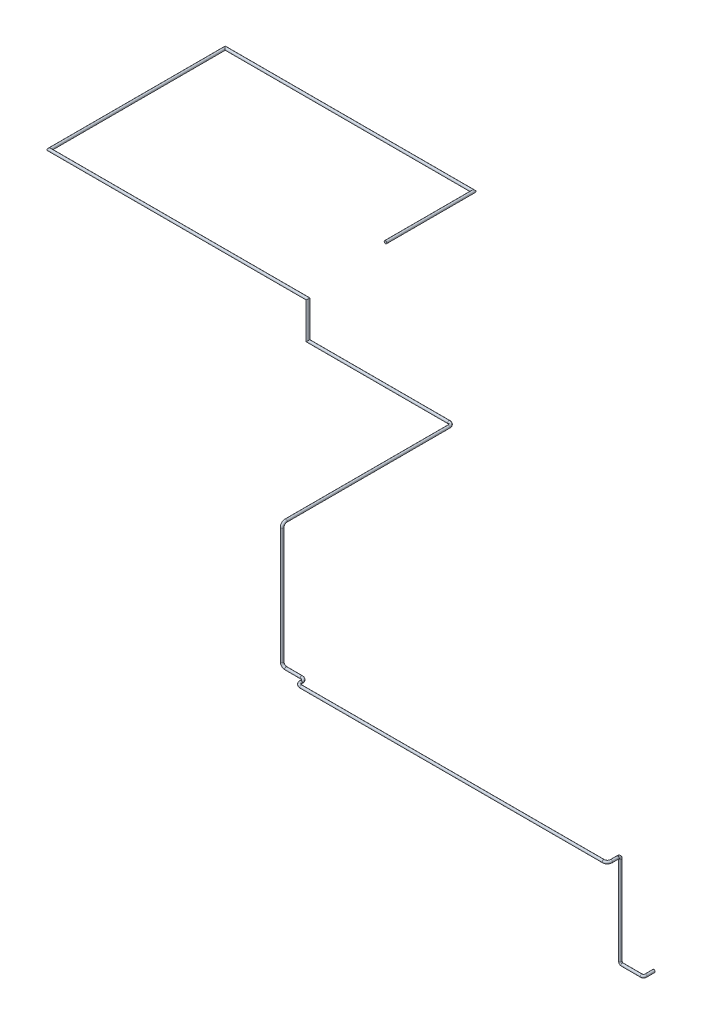
ISO-10303-21;
HEADER;
FILE_DESCRIPTION(('STEP AP214'),'2;1');
FILE_NAME('part.step','',(''),(''),'','','');
FILE_SCHEMA(('AUTOMOTIVE_DESIGN { 1 0 10303 214 1 1 1 1 }'));
ENDSEC;
DATA;
#1=APPLICATION_CONTEXT('core data for automotive mechanical design processes');
#2=APPLICATION_PROTOCOL_DEFINITION('international standard','automotive_design',2000,#1);
#3=PRODUCT_CONTEXT('',#1,'mechanical');
#4=PRODUCT('Part','Part','',(#3));
#5=PRODUCT_RELATED_PRODUCT_CATEGORY('part','',(#4));
#6=PRODUCT_DEFINITION_FORMATION('','',#4);
#7=PRODUCT_DEFINITION_CONTEXT('part definition',#1,'design');
#8=PRODUCT_DEFINITION('design','',#6,#7);
#9=PRODUCT_DEFINITION_SHAPE('','',#8);
#10=(LENGTH_UNIT() NAMED_UNIT(*) SI_UNIT(.MILLI.,.METRE.));
#11=(NAMED_UNIT(*) PLANE_ANGLE_UNIT() SI_UNIT($,.RADIAN.));
#12=(NAMED_UNIT(*) SI_UNIT($,.STERADIAN.) SOLID_ANGLE_UNIT());
#13=UNCERTAINTY_MEASURE_WITH_UNIT(LENGTH_MEASURE(1.E-05),#10,'distance_accuracy_value','');
#14=(GEOMETRIC_REPRESENTATION_CONTEXT(3) GLOBAL_UNCERTAINTY_ASSIGNED_CONTEXT((#13)) GLOBAL_UNIT_ASSIGNED_CONTEXT((#10,
#11,#12)) REPRESENTATION_CONTEXT('',''));
#15=CARTESIAN_POINT('',(0.,0.,0.));
#16=DIRECTION('',(0.,0.,1.));
#17=DIRECTION('',(1.,0.,0.));
#18=AXIS2_PLACEMENT_3D('',#15,#16,#17);
#19=CARTESIAN_POINT('',(0.,0.,100.));
#20=DIRECTION('',(0.,0.,-1.));
#21=DIRECTION('',(-1.,0.,0.));
#22=AXIS2_PLACEMENT_3D('',#19,#20,#21);
#23=CYLINDRICAL_SURFACE('',#22,25.4);
#24=CARTESIAN_POINT('',(0.,0.,0.));
#25=DIRECTION('',(0.,0.,1.));
#26=DIRECTION('',(1.,0.,0.));
#27=AXIS2_PLACEMENT_3D('',#24,#25,#26);
#28=CIRCLE('',#27,25.4);
#29=CARTESIAN_POINT('',(25.4,0.,0.));
#30=VERTEX_POINT('',#29);
#31=EDGE_CURVE('E11',#30,#30,#28,.T.);
#32=ORIENTED_EDGE('',*,*,#31,.T.);
#33=EDGE_LOOP('',(#32));
#34=FACE_BOUND('',#33,.T.);
#35=CARTESIAN_POINT('',(0.,0.,125.));
#36=DIRECTION('',(0.,0.,1.));
#37=DIRECTION('',(1.,0.,0.));
#38=AXIS2_PLACEMENT_3D('',#35,#36,#37);
#39=CIRCLE('',#38,25.4);
#40=CARTESIAN_POINT('',(25.4,0.,125.));
#41=VERTEX_POINT('',#40);
#42=EDGE_CURVE('E42',#41,#41,#39,.T.);
#43=ORIENTED_EDGE('',*,*,#42,.F.);
#44=EDGE_LOOP('',(#43));
#45=FACE_BOUND('',#44,.T.);
#46=ADVANCED_FACE('F35',(#34,#45),#23,.T.);
#47=CARTESIAN_POINT('',(0.,0.,0.));
#48=DIRECTION('',(0.,0.,1.));
#49=DIRECTION('',(1.,0.,0.));
#50=AXIS2_PLACEMENT_3D('',#47,#48,#49);
#51=PLANE('',#50);
#52=CARTESIAN_POINT('',(0.,0.,0.));
#53=DIRECTION('',(0.,0.,-1.));
#54=DIRECTION('',(-1.,0.,0.));
#55=AXIS2_PLACEMENT_3D('',#52,#53,#54);
#56=CIRCLE('',#55,25.);
#57=CARTESIAN_POINT('',(-25.,0.,0.));
#58=VERTEX_POINT('',#57);
#59=EDGE_CURVE('E428',#58,#58,#56,.T.);
#60=ORIENTED_EDGE('',*,*,#59,.F.);
#61=EDGE_LOOP('',(#60));
#62=FACE_BOUND('',#61,.T.);
#63=ORIENTED_EDGE('',*,*,#31,.F.);
#64=EDGE_LOOP('',(#63));
#65=FACE_BOUND('',#64,.T.);
#66=ADVANCED_FACE('F143',(#62,#65),#51,.F.);
#67=CARTESIAN_POINT('',(-9450.,3100.,-4960.));
#68=DIRECTION('',(0.,0.,1.));
#69=DIRECTION('',(0.,1.,0.));
#70=AXIS2_PLACEMENT_3D('',#67,#68,#69);
#71=PLANE('',#70);
#72=CARTESIAN_POINT('',(-9450.,3100.,-4960.));
#73=DIRECTION('',(0.,0.,1.));
#74=DIRECTION('',(0.,1.,0.));
#75=AXIS2_PLACEMENT_3D('',#72,#73,#74);
#76=CIRCLE('',#75,25.4);
#77=CARTESIAN_POINT('',(-9450.,3125.4,-4960.));
#78=VERTEX_POINT('',#77);
#79=EDGE_CURVE('E47',#78,#78,#76,.T.);
#80=ORIENTED_EDGE('',*,*,#79,.T.);
#81=EDGE_LOOP('',(#80));
#82=FACE_BOUND('',#81,.T.);
#83=ADVANCED_FACE('F140',(#82),#71,.T.);
#84=CARTESIAN_POINT('',(-9450.,3100.,-6715.98));
#85=DIRECTION('',(0.,0.,1.));
#86=DIRECTION('',(1.,0.,0.));
#87=AXIS2_PLACEMENT_3D('',#84,#85,#86);
#88=CYLINDRICAL_SURFACE('',#87,25.4);
#89=CARTESIAN_POINT('',(-9450.,3100.,-6660.));
#90=DIRECTION('',(0.707106781186547,0.,0.707106781186547));
#91=DIRECTION('',(0.707106781186548,0.,-0.707106781186548));
#92=AXIS2_PLACEMENT_3D('',#89,#90,#91);
#93=ELLIPSE('',#92,35.9210244842766,25.4);
#94=CARTESIAN_POINT('',(-9424.6,3100.,-6685.4));
#95=VERTEX_POINT('',#94);
#96=EDGE_CURVE('E52',#95,#95,#93,.F.);
#97=ORIENTED_EDGE('',*,*,#96,.F.);
#98=EDGE_LOOP('',(#97));
#99=FACE_BOUND('',#98,.T.);
#100=ORIENTED_EDGE('',*,*,#79,.F.);
#101=EDGE_LOOP('',(#100));
#102=FACE_BOUND('',#101,.T.);
#103=ADVANCED_FACE('F130',(#99,#102),#88,.T.);
#104=CARTESIAN_POINT('',(-14305.98,3100.,-6660.));
#105=DIRECTION('',(1.,0.,0.));
#106=DIRECTION('',(0.,0.,-1.));
#107=AXIS2_PLACEMENT_3D('',#104,#105,#106);
#108=CYLINDRICAL_SURFACE('',#107,25.4);
#109=CARTESIAN_POINT('',(-14250.,3100.,-6660.));
#110=DIRECTION('',(0.707106781186547,0.,-0.707106781186547));
#111=DIRECTION('',(-0.707106781186548,0.,-0.707106781186548));
#112=AXIS2_PLACEMENT_3D('',#109,#110,#111);
#113=ELLIPSE('',#112,35.9210244842766,25.4);
#114=CARTESIAN_POINT('',(-14275.4,3100.,-6685.4));
#115=VERTEX_POINT('',#114);
#116=EDGE_CURVE('E123',#115,#115,#113,.F.);
#117=ORIENTED_EDGE('',*,*,#116,.F.);
#118=EDGE_LOOP('',(#117));
#119=FACE_BOUND('',#118,.T.);
#120=ORIENTED_EDGE('',*,*,#96,.T.);
#121=EDGE_LOOP('',(#120));
#122=FACE_BOUND('',#121,.T.);
#123=ADVANCED_FACE('F127',(#119,#122),#108,.T.);
#124=CARTESIAN_POINT('',(-14250.,3100.,-3204.02));
#125=DIRECTION('',(0.,0.,-1.));
#126=DIRECTION('',(-1.,0.,0.));
#127=AXIS2_PLACEMENT_3D('',#124,#125,#126);
#128=CYLINDRICAL_SURFACE('',#127,25.4);
#129=CARTESIAN_POINT('',(-14250.,3100.,-3260.));
#130=DIRECTION('',(-0.707106781186547,0.,-0.707106781186547));
#131=DIRECTION('',(-0.707106781186548,0.,0.707106781186548));
#132=AXIS2_PLACEMENT_3D('',#129,#130,#131);
#133=ELLIPSE('',#132,35.9210244842766,25.4);
#134=CARTESIAN_POINT('',(-14275.4,3100.,-3234.6));
#135=VERTEX_POINT('',#134);
#136=EDGE_CURVE('E120',#135,#135,#133,.F.);
#137=ORIENTED_EDGE('',*,*,#136,.F.);
#138=EDGE_LOOP('',(#137));
#139=FACE_BOUND('',#138,.T.);
#140=ORIENTED_EDGE('',*,*,#116,.T.);
#141=EDGE_LOOP('',(#140));
#142=FACE_BOUND('',#141,.T.);
#143=ADVANCED_FACE('F129',(#139,#142),#128,.T.);
#144=CARTESIAN_POINT('',(-9221.96,3100.,-3260.));
#145=DIRECTION('',(-1.,0.,0.));
#146=DIRECTION('',(0.,0.,1.));
#147=AXIS2_PLACEMENT_3D('',#144,#145,#146);
#148=CYLINDRICAL_SURFACE('',#147,25.4);
#149=CARTESIAN_POINT('',(-9250.,3100.,-3260.));
#150=DIRECTION('',(-0.707106781186548,0.707106781186548,0.));
#151=DIRECTION('',(0.707106781186548,0.707106781186548,0.));
#152=AXIS2_PLACEMENT_3D('',#149,#150,#151);
#153=ELLIPSE('',#152,35.9210244842766,25.4);
#154=CARTESIAN_POINT('',(-9224.6,3125.4,-3260.));
#155=VERTEX_POINT('',#154);
#156=EDGE_CURVE('E117',#155,#155,#153,.F.);
#157=ORIENTED_EDGE('',*,*,#156,.F.);
#158=EDGE_LOOP('',(#157));
#159=FACE_BOUND('',#158,.T.);
#160=ORIENTED_EDGE('',*,*,#136,.T.);
#161=EDGE_LOOP('',(#160));
#162=FACE_BOUND('',#161,.T.);
#163=ADVANCED_FACE('F137',(#159,#162),#148,.T.);
#164=CARTESIAN_POINT('',(-9250.,2371.96,-3260.));
#165=DIRECTION('',(0.,1.,0.));
#166=DIRECTION('',(0.,0.,1.));
#167=AXIS2_PLACEMENT_3D('',#164,#165,#166);
#168=CYLINDRICAL_SURFACE('',#167,25.4);
#169=CARTESIAN_POINT('',(-9250.,2400.,-3260.));
#170=DIRECTION('',(-0.707106781186547,0.707106781186547,0.));
#171=DIRECTION('',(-0.707106781186548,-0.707106781186548,0.));
#172=AXIS2_PLACEMENT_3D('',#169,#170,#171);
#173=ELLIPSE('',#172,35.9210244842766,25.4);
#174=CARTESIAN_POINT('',(-9275.4,2374.6,-3260.));
#175=VERTEX_POINT('',#174);
#176=EDGE_CURVE('E83',#175,#175,#173,.F.);
#177=ORIENTED_EDGE('',*,*,#176,.F.);
#178=EDGE_LOOP('',(#177));
#179=FACE_BOUND('',#178,.T.);
#180=ORIENTED_EDGE('',*,*,#156,.T.);
#181=EDGE_LOOP('',(#180));
#182=FACE_BOUND('',#181,.T.);
#183=ADVANCED_FACE('F157',(#179,#182),#168,.T.);
#184=CARTESIAN_POINT('',(-75.,0.,125.));
#185=DIRECTION('',(0.,-1.,0.));
#186=DIRECTION('',(0.,0.,-1.));
#187=AXIS2_PLACEMENT_3D('',#184,#185,#186);
#188=TOROIDAL_SURFACE('',#187,75.,25.4);
#189=CARTESIAN_POINT('',(-75.,0.,200.));
#190=DIRECTION('',(-1.,0.,0.));
#191=DIRECTION('',(0.,0.,1.));
#192=AXIS2_PLACEMENT_3D('',#189,#190,#191);
#193=CIRCLE('',#192,25.4);
#194=CARTESIAN_POINT('',(-75.,0.,225.4));
#195=VERTEX_POINT('',#194);
#196=EDGE_CURVE('E110',#195,#195,#193,.T.);
#197=CARTESIAN_POINT('',(-75.,0.,125.));
#198=DIRECTION('',(0.,-1.,0.));
#199=DIRECTION('',(0.,0.,-1.));
#200=AXIS2_PLACEMENT_3D('',#197,#198,#199);
#201=CIRCLE('',#200,100.4);
#202=EDGE_CURVE('',#41,#195,#201,.T.);
#203=ORIENTED_EDGE('',*,*,#42,.T.);
#204=ORIENTED_EDGE('',*,*,#196,.F.);
#205=ORIENTED_EDGE('',*,*,#202,.T.);
#206=ORIENTED_EDGE('',*,*,#202,.F.);
#207=EDGE_LOOP('',(#203,#205,#204,#206));
#208=FACE_BOUND('',#207,.T.);
#209=ADVANCED_FACE('F154',(#208),#188,.T.);
#210=CARTESIAN_POINT('',(-75.,0.,200.));
#211=DIRECTION('',(-1.,0.,0.));
#212=DIRECTION('',(0.,0.,1.));
#213=AXIS2_PLACEMENT_3D('',#210,#211,#212);
#214=CYLINDRICAL_SURFACE('',#213,25.4);
#215=CARTESIAN_POINT('',(-5925.,0.,200.));
#216=DIRECTION('',(-1.,0.,0.));
#217=DIRECTION('',(0.,0.,1.));
#218=AXIS2_PLACEMENT_3D('',#215,#216,#217);
#219=CIRCLE('',#218,25.4);
#220=CARTESIAN_POINT('',(-5925.,0.,225.4));
#221=VERTEX_POINT('',#220);
#222=EDGE_CURVE('E107',#221,#221,#219,.T.);
#223=ORIENTED_EDGE('',*,*,#222,.F.);
#224=EDGE_LOOP('',(#223));
#225=FACE_BOUND('',#224,.T.);
#226=ORIENTED_EDGE('',*,*,#196,.T.);
#227=EDGE_LOOP('',(#226));
#228=FACE_BOUND('',#227,.T.);
#229=ADVANCED_FACE('F156',(#225,#228),#214,.T.);
#230=CARTESIAN_POINT('',(-5925.,0.,125.));
#231=DIRECTION('',(0.,-1.,0.));
#232=DIRECTION('',(0.,0.,-1.));
#233=AXIS2_PLACEMENT_3D('',#230,#231,#232);
#234=TOROIDAL_SURFACE('',#233,75.0000000000001,25.4);
#235=CARTESIAN_POINT('',(-6000.,0.,125.));
#236=DIRECTION('',(0.,0.,-1.));
#237=DIRECTION('',(-1.,0.,0.));
#238=AXIS2_PLACEMENT_3D('',#235,#236,#237);
#239=CIRCLE('',#238,25.4);
#240=CARTESIAN_POINT('',(-6025.4,0.,125.));
#241=VERTEX_POINT('',#240);
#242=EDGE_CURVE('E104',#241,#241,#239,.T.);
#243=CARTESIAN_POINT('',(-5925.,0.,125.));
#244=DIRECTION('',(0.,-1.,0.));
#245=DIRECTION('',(0.,0.,-1.));
#246=AXIS2_PLACEMENT_3D('',#243,#244,#245);
#247=CIRCLE('',#246,100.4);
#248=EDGE_CURVE('',#221,#241,#247,.T.);
#249=ORIENTED_EDGE('',*,*,#222,.T.);
#250=ORIENTED_EDGE('',*,*,#242,.F.);
#251=ORIENTED_EDGE('',*,*,#248,.T.);
#252=ORIENTED_EDGE('',*,*,#248,.F.);
#253=EDGE_LOOP('',(#249,#251,#250,#252));
#254=FACE_BOUND('',#253,.T.);
#255=ADVANCED_FACE('F164',(#254),#234,.T.);
#256=CARTESIAN_POINT('',(-6000.,0.,125.));
#257=DIRECTION('',(0.,0.,-1.));
#258=DIRECTION('',(-1.,0.,0.));
#259=AXIS2_PLACEMENT_3D('',#256,#257,#258);
#260=CYLINDRICAL_SURFACE('',#259,25.4);
#261=CARTESIAN_POINT('',(-6000.,0.,115.));
#262=DIRECTION('',(0.,0.,-1.));
#263=DIRECTION('',(-1.,0.,0.));
#264=AXIS2_PLACEMENT_3D('',#261,#262,#263);
#265=CIRCLE('',#264,25.4);
#266=CARTESIAN_POINT('',(-5974.6,0.,115.));
#267=VERTEX_POINT('',#266);
#268=EDGE_CURVE('E101',#267,#267,#265,.T.);
#269=ORIENTED_EDGE('',*,*,#268,.F.);
#270=EDGE_LOOP('',(#269));
#271=FACE_BOUND('',#270,.T.);
#272=ORIENTED_EDGE('',*,*,#242,.T.);
#273=EDGE_LOOP('',(#272));
#274=FACE_BOUND('',#273,.T.);
#275=ADVANCED_FACE('F208',(#271,#274),#260,.T.);
#276=CARTESIAN_POINT('',(-6075.,0.,115.));
#277=DIRECTION('',(0.,1.,0.));
#278=DIRECTION('',(0.,0.,1.));
#279=AXIS2_PLACEMENT_3D('',#276,#277,#278);
#280=TOROIDAL_SURFACE('',#279,75.0000000000002,25.4);
#281=CARTESIAN_POINT('',(-6075.,0.,39.9999999999999));
#282=DIRECTION('',(-1.,0.,0.));
#283=DIRECTION('',(0.,0.,1.));
#284=AXIS2_PLACEMENT_3D('',#281,#282,#283);
#285=CIRCLE('',#284,25.4);
#286=CARTESIAN_POINT('',(-6075.,0.,14.5999999999998));
#287=VERTEX_POINT('',#286);
#288=EDGE_CURVE('E98',#287,#287,#285,.T.);
#289=CARTESIAN_POINT('',(-6075.,0.,115.));
#290=DIRECTION('',(0.,1.,0.));
#291=DIRECTION('',(0.,0.,1.));
#292=AXIS2_PLACEMENT_3D('',#289,#290,#291);
#293=CIRCLE('',#292,100.4);
#294=EDGE_CURVE('',#267,#287,#293,.T.);
#295=ORIENTED_EDGE('',*,*,#268,.T.);
#296=ORIENTED_EDGE('',*,*,#288,.F.);
#297=ORIENTED_EDGE('',*,*,#294,.T.);
#298=ORIENTED_EDGE('',*,*,#294,.F.);
#299=EDGE_LOOP('',(#295,#297,#296,#298));
#300=FACE_BOUND('',#299,.T.);
#301=ADVANCED_FACE('F217',(#300),#280,.T.);
#302=CARTESIAN_POINT('',(-6075.,0.,40.));
#303=DIRECTION('',(-1.,0.,0.));
#304=DIRECTION('',(0.,0.,1.));
#305=AXIS2_PLACEMENT_3D('',#302,#303,#304);
#306=CYLINDRICAL_SURFACE('',#305,25.4);
#307=CARTESIAN_POINT('',(-6375.,0.,40.));
#308=DIRECTION('',(-1.,0.,0.));
#309=DIRECTION('',(0.,0.,1.));
#310=AXIS2_PLACEMENT_3D('',#307,#308,#309);
#311=CIRCLE('',#310,25.4);
#312=CARTESIAN_POINT('',(-6375.,-25.4000000000001,40.));
#313=VERTEX_POINT('',#312);
#314=EDGE_CURVE('E95',#313,#313,#311,.T.);
#315=ORIENTED_EDGE('',*,*,#314,.F.);
#316=EDGE_LOOP('',(#315));
#317=FACE_BOUND('',#316,.T.);
#318=ORIENTED_EDGE('',*,*,#288,.T.);
#319=EDGE_LOOP('',(#318));
#320=FACE_BOUND('',#319,.T.);
#321=ADVANCED_FACE('F227',(#317,#320),#306,.T.);
#322=CARTESIAN_POINT('',(-6375.,75.,40.));
#323=DIRECTION('',(0.,0.,-1.));
#324=DIRECTION('',(-1.,0.,0.));
#325=AXIS2_PLACEMENT_3D('',#322,#323,#324);
#326=TOROIDAL_SURFACE('',#325,75.0000000000001,25.4);
#327=CARTESIAN_POINT('',(-6450.,75.,40.));
#328=DIRECTION('',(0.,1.,0.));
#329=DIRECTION('',(0.,0.,1.));
#330=AXIS2_PLACEMENT_3D('',#327,#328,#329);
#331=CIRCLE('',#330,25.4);
#332=CARTESIAN_POINT('',(-6475.4,75.,40.));
#333=VERTEX_POINT('',#332);
#334=EDGE_CURVE('E92',#333,#333,#331,.T.);
#335=CARTESIAN_POINT('',(-6375.,75.,40.));
#336=DIRECTION('',(0.,0.,-1.));
#337=DIRECTION('',(-1.,0.,0.));
#338=AXIS2_PLACEMENT_3D('',#335,#336,#337);
#339=CIRCLE('',#338,100.4);
#340=EDGE_CURVE('',#313,#333,#339,.T.);
#341=ORIENTED_EDGE('',*,*,#314,.T.);
#342=ORIENTED_EDGE('',*,*,#334,.F.);
#343=ORIENTED_EDGE('',*,*,#340,.T.);
#344=ORIENTED_EDGE('',*,*,#340,.F.);
#345=EDGE_LOOP('',(#341,#343,#342,#344));
#346=FACE_BOUND('',#345,.T.);
#347=ADVANCED_FACE('F237',(#346),#326,.T.);
#348=CARTESIAN_POINT('',(-6450.,75.,40.));
#349=DIRECTION('',(0.,1.,0.));
#350=DIRECTION('',(0.,0.,1.));
#351=AXIS2_PLACEMENT_3D('',#348,#349,#350);
#352=CYLINDRICAL_SURFACE('',#351,25.4);
#353=CARTESIAN_POINT('',(-6450.,2325.,40.));
#354=DIRECTION('',(0.,1.,0.));
#355=DIRECTION('',(0.,0.,1.));
#356=AXIS2_PLACEMENT_3D('',#353,#354,#355);
#357=CIRCLE('',#356,25.4);
#358=CARTESIAN_POINT('',(-6450.,2325.,65.4000000000001));
#359=VERTEX_POINT('',#358);
#360=EDGE_CURVE('E89',#359,#359,#357,.T.);
#361=ORIENTED_EDGE('',*,*,#360,.F.);
#362=EDGE_LOOP('',(#361));
#363=FACE_BOUND('',#362,.T.);
#364=ORIENTED_EDGE('',*,*,#334,.T.);
#365=EDGE_LOOP('',(#364));
#366=FACE_BOUND('',#365,.T.);
#367=ADVANCED_FACE('F247',(#363,#366),#352,.T.);
#368=CARTESIAN_POINT('',(-6450.,2325.,-35.));
#369=DIRECTION('',(-1.,0.,0.));
#370=DIRECTION('',(0.,0.,1.));
#371=AXIS2_PLACEMENT_3D('',#368,#369,#370);
#372=TOROIDAL_SURFACE('',#371,75.0000000000001,25.4);
#373=CARTESIAN_POINT('',(-6450.,2400.,-35.));
#374=DIRECTION('',(0.,0.,-1.));
#375=DIRECTION('',(0.,1.,0.));
#376=AXIS2_PLACEMENT_3D('',#373,#374,#375);
#377=CIRCLE('',#376,25.4);
#378=CARTESIAN_POINT('',(-6450.,2425.4,-35.));
#379=VERTEX_POINT('',#378);
#380=EDGE_CURVE('E86',#379,#379,#377,.T.);
#381=CARTESIAN_POINT('',(-6450.,2325.,-35.));
#382=DIRECTION('',(-1.,0.,0.));
#383=DIRECTION('',(0.,0.,1.));
#384=AXIS2_PLACEMENT_3D('',#381,#382,#383);
#385=CIRCLE('',#384,100.4);
#386=EDGE_CURVE('',#359,#379,#385,.T.);
#387=ORIENTED_EDGE('',*,*,#360,.T.);
#388=ORIENTED_EDGE('',*,*,#380,.F.);
#389=ORIENTED_EDGE('',*,*,#386,.T.);
#390=ORIENTED_EDGE('',*,*,#386,.F.);
#391=EDGE_LOOP('',(#387,#389,#388,#390));
#392=FACE_BOUND('',#391,.T.);
#393=ADVANCED_FACE('F257',(#392),#372,.T.);
#394=CARTESIAN_POINT('',(-6450.,2400.,-35.));
#395=DIRECTION('',(0.,0.,-1.));
#396=DIRECTION('',(-1.,0.,0.));
#397=AXIS2_PLACEMENT_3D('',#394,#395,#396);
#398=CYLINDRICAL_SURFACE('',#397,25.4);
#399=CARTESIAN_POINT('',(-6450.,2400.,-3185.));
#400=DIRECTION('',(0.,0.,-1.));
#401=DIRECTION('',(0.,1.,0.));
#402=AXIS2_PLACEMENT_3D('',#399,#400,#401);
#403=CIRCLE('',#402,25.4);
#404=CARTESIAN_POINT('',(-6424.6,2400.,-3185.));
#405=VERTEX_POINT('',#404);
#406=EDGE_CURVE('E82',#405,#405,#403,.T.);
#407=ORIENTED_EDGE('',*,*,#406,.F.);
#408=EDGE_LOOP('',(#407));
#409=FACE_BOUND('',#408,.T.);
#410=ORIENTED_EDGE('',*,*,#380,.T.);
#411=EDGE_LOOP('',(#410));
#412=FACE_BOUND('',#411,.T.);
#413=ADVANCED_FACE('F267',(#409,#412),#398,.T.);
#414=CARTESIAN_POINT('',(-6525.,2400.,-3185.));
#415=DIRECTION('',(0.,1.,0.));
#416=DIRECTION('',(0.,0.,1.));
#417=AXIS2_PLACEMENT_3D('',#414,#415,#416);
#418=TOROIDAL_SURFACE('',#417,75.0000000000002,25.4);
#419=CARTESIAN_POINT('',(-6525.,2400.,-3260.));
#420=DIRECTION('',(-1.,0.,0.));
#421=DIRECTION('',(0.,1.,0.));
#422=AXIS2_PLACEMENT_3D('',#419,#420,#421);
#423=CIRCLE('',#422,25.4);
#424=CARTESIAN_POINT('',(-6525.,2400.,-3285.4));
#425=VERTEX_POINT('',#424);
#426=EDGE_CURVE('E79',#425,#425,#423,.T.);
#427=CARTESIAN_POINT('',(-6525.,2400.,-3185.));
#428=DIRECTION('',(0.,1.,0.));
#429=DIRECTION('',(0.,0.,1.));
#430=AXIS2_PLACEMENT_3D('',#427,#428,#429);
#431=CIRCLE('',#430,100.4);
#432=EDGE_CURVE('',#405,#425,#431,.T.);
#433=ORIENTED_EDGE('',*,*,#406,.T.);
#434=ORIENTED_EDGE('',*,*,#426,.F.);
#435=ORIENTED_EDGE('',*,*,#432,.T.);
#436=ORIENTED_EDGE('',*,*,#432,.F.);
#437=EDGE_LOOP('',(#433,#435,#434,#436));
#438=FACE_BOUND('',#437,.T.);
#439=ADVANCED_FACE('F173',(#438),#418,.T.);
#440=CARTESIAN_POINT('',(-6525.,2400.,-3260.));
#441=DIRECTION('',(-1.,0.,0.));
#442=DIRECTION('',(0.,0.,1.));
#443=AXIS2_PLACEMENT_3D('',#440,#441,#442);
#444=CYLINDRICAL_SURFACE('',#443,25.4);
#445=ORIENTED_EDGE('',*,*,#426,.T.);
#446=EDGE_LOOP('',(#445));
#447=FACE_BOUND('',#446,.T.);
#448=ORIENTED_EDGE('',*,*,#176,.T.);
#449=EDGE_LOOP('',(#448));
#450=FACE_BOUND('',#449,.T.);
#451=ADVANCED_FACE('F149',(#447,#450),#444,.T.);
#452=CARTESIAN_POINT('',(450.,-1800.,-250.));
#453=DIRECTION('',(0.,0.,-1.));
#454=DIRECTION('',(0.,-1.,0.));
#455=AXIS2_PLACEMENT_3D('',#452,#453,#454);
#456=PLANE('',#455);
#457=CARTESIAN_POINT('',(450.,-1800.,-250.));
#458=DIRECTION('',(0.,0.,-1.));
#459=DIRECTION('',(0.,-1.,0.));
#460=AXIS2_PLACEMENT_3D('',#457,#458,#459);
#461=CIRCLE('',#460,25.);
#462=CARTESIAN_POINT('',(450.,-1825.,-250.));
#463=VERTEX_POINT('',#462);
#464=EDGE_CURVE('E69',#463,#463,#461,.T.);
#465=ORIENTED_EDGE('',*,*,#464,.T.);
#466=EDGE_LOOP('',(#465));
#467=FACE_BOUND('',#466,.T.);
#468=ADVANCED_FACE('F70',(#467),#456,.T.);
#469=CARTESIAN_POINT('',(0.,0.,0.));
#470=DIRECTION('',(0.,0.,-1.));
#471=DIRECTION('',(-1.,0.,0.));
#472=AXIS2_PLACEMENT_3D('',#469,#470,#471);
#473=CYLINDRICAL_SURFACE('',#472,25.);
#474=CARTESIAN_POINT('',(0.,0.,-10.));
#475=DIRECTION('',(0.,0.,-1.));
#476=DIRECTION('',(-1.,0.,0.));
#477=AXIS2_PLACEMENT_3D('',#474,#475,#476);
#478=CIRCLE('',#477,25.);
#479=CARTESIAN_POINT('',(0.,25.,-10.));
#480=VERTEX_POINT('',#479);
#481=EDGE_CURVE('E425',#480,#480,#478,.T.);
#482=ORIENTED_EDGE('',*,*,#481,.F.);
#483=EDGE_LOOP('',(#482));
#484=FACE_BOUND('',#483,.T.);
#485=ORIENTED_EDGE('',*,*,#59,.T.);
#486=EDGE_LOOP('',(#485));
#487=FACE_BOUND('',#486,.T.);
#488=ADVANCED_FACE('F310',(#484,#487),#473,.T.);
#489=CARTESIAN_POINT('',(0.,-40.,-10.));
#490=DIRECTION('',(-1.,0.,0.));
#491=DIRECTION('',(0.,0.,1.));
#492=AXIS2_PLACEMENT_3D('',#489,#490,#491);
#493=TOROIDAL_SURFACE('',#492,40.,25.);
#494=CARTESIAN_POINT('',(0.,-40.,-50.));
#495=DIRECTION('',(0.,-1.,0.));
#496=DIRECTION('',(-1.,0.,0.));
#497=AXIS2_PLACEMENT_3D('',#494,#495,#496);
#498=CIRCLE('',#497,25.);
#499=CARTESIAN_POINT('',(0.,-40.,-75.));
#500=VERTEX_POINT('',#499);
#501=EDGE_CURVE('E422',#500,#500,#498,.T.);
#502=CARTESIAN_POINT('',(0.,-40.,-10.));
#503=DIRECTION('',(-1.,0.,0.));
#504=DIRECTION('',(0.,0.,1.));
#505=AXIS2_PLACEMENT_3D('',#502,#503,#504);
#506=CIRCLE('',#505,65.);
#507=EDGE_CURVE('',#480,#500,#506,.T.);
#508=ORIENTED_EDGE('',*,*,#481,.T.);
#509=ORIENTED_EDGE('',*,*,#501,.F.);
#510=ORIENTED_EDGE('',*,*,#507,.T.);
#511=ORIENTED_EDGE('',*,*,#507,.F.);
#512=EDGE_LOOP('',(#508,#510,#509,#511));
#513=FACE_BOUND('',#512,.T.);
#514=ADVANCED_FACE('F319',(#513),#493,.T.);
#515=CARTESIAN_POINT('',(0.,-40.,-50.));
#516=DIRECTION('',(0.,-1.,0.));
#517=DIRECTION('',(0.,0.,-1.));
#518=AXIS2_PLACEMENT_3D('',#515,#516,#517);
#519=CYLINDRICAL_SURFACE('',#518,25.);
#520=CARTESIAN_POINT('',(0.,-1760.,-50.));
#521=DIRECTION('',(0.,-1.,0.));
#522=DIRECTION('',(-1.,0.,0.));
#523=AXIS2_PLACEMENT_3D('',#520,#521,#522);
#524=CIRCLE('',#523,25.);
#525=CARTESIAN_POINT('',(-25.,-1760.,-50.));
#526=VERTEX_POINT('',#525);
#527=EDGE_CURVE('E417',#526,#526,#524,.T.);
#528=ORIENTED_EDGE('',*,*,#527,.F.);
#529=EDGE_LOOP('',(#528));
#530=FACE_BOUND('',#529,.T.);
#531=ORIENTED_EDGE('',*,*,#501,.T.);
#532=EDGE_LOOP('',(#531));
#533=FACE_BOUND('',#532,.T.);
#534=ADVANCED_FACE('F329',(#530,#533),#519,.T.);
#535=CARTESIAN_POINT('',(40.,-1760.,-50.));
#536=DIRECTION('',(0.,0.,1.));
#537=DIRECTION('',(1.,0.,0.));
#538=AXIS2_PLACEMENT_3D('',#535,#536,#537);
#539=TOROIDAL_SURFACE('',#538,40.,25.);
#540=CARTESIAN_POINT('',(40.,-1800.,-50.));
#541=DIRECTION('',(1.,0.,0.));
#542=DIRECTION('',(0.,-1.,0.));
#543=AXIS2_PLACEMENT_3D('',#540,#541,#542);
#544=CIRCLE('',#543,25.);
#545=CARTESIAN_POINT('',(40.,-1825.,-50.));
#546=VERTEX_POINT('',#545);
#547=EDGE_CURVE('E415',#546,#546,#544,.T.);
#548=CARTESIAN_POINT('',(40.,-1760.,-50.));
#549=DIRECTION('',(0.,0.,1.));
#550=DIRECTION('',(1.,0.,0.));
#551=AXIS2_PLACEMENT_3D('',#548,#549,#550);
#552=CIRCLE('',#551,65.);
#553=EDGE_CURVE('',#526,#546,#552,.T.);
#554=ORIENTED_EDGE('',*,*,#527,.T.);
#555=ORIENTED_EDGE('',*,*,#547,.F.);
#556=ORIENTED_EDGE('',*,*,#553,.T.);
#557=ORIENTED_EDGE('',*,*,#553,.F.);
#558=EDGE_LOOP('',(#554,#556,#555,#557));
#559=FACE_BOUND('',#558,.T.);
#560=ADVANCED_FACE('F339',(#559),#539,.T.);
#561=CARTESIAN_POINT('',(40.,-1800.,-50.));
#562=DIRECTION('',(1.,0.,0.));
#563=DIRECTION('',(0.,0.,-1.));
#564=AXIS2_PLACEMENT_3D('',#561,#562,#563);
#565=CYLINDRICAL_SURFACE('',#564,25.);
#566=CARTESIAN_POINT('',(410.,-1800.,-50.));
#567=DIRECTION('',(1.,0.,0.));
#568=DIRECTION('',(0.,-1.,0.));
#569=AXIS2_PLACEMENT_3D('',#566,#567,#568);
#570=CIRCLE('',#569,25.);
#571=CARTESIAN_POINT('',(410.,-1800.,-25.));
#572=VERTEX_POINT('',#571);
#573=EDGE_CURVE('E75',#572,#572,#570,.T.);
#574=ORIENTED_EDGE('',*,*,#573,.F.);
#575=EDGE_LOOP('',(#574));
#576=FACE_BOUND('',#575,.T.);
#577=ORIENTED_EDGE('',*,*,#547,.T.);
#578=EDGE_LOOP('',(#577));
#579=FACE_BOUND('',#578,.T.);
#580=ADVANCED_FACE('F349',(#576,#579),#565,.T.);
#581=CARTESIAN_POINT('',(410.,-1800.,-90.));
#582=DIRECTION('',(0.,1.,0.));
#583=DIRECTION('',(0.,0.,1.));
#584=AXIS2_PLACEMENT_3D('',#581,#582,#583);
#585=TOROIDAL_SURFACE('',#584,40.,25.);
#586=CARTESIAN_POINT('',(450.,-1800.,-90.));
#587=DIRECTION('',(0.,0.,-1.));
#588=DIRECTION('',(0.,-1.,0.));
#589=AXIS2_PLACEMENT_3D('',#586,#587,#588);
#590=CIRCLE('',#589,25.);
#591=CARTESIAN_POINT('',(475.,-1800.,-90.));
#592=VERTEX_POINT('',#591);
#593=EDGE_CURVE('E72',#592,#592,#590,.T.);
#594=CARTESIAN_POINT('',(410.,-1800.,-90.));
#595=DIRECTION('',(0.,1.,0.));
#596=DIRECTION('',(0.,0.,1.));
#597=AXIS2_PLACEMENT_3D('',#594,#595,#596);
#598=CIRCLE('',#597,65.);
#599=EDGE_CURVE('',#572,#592,#598,.T.);
#600=ORIENTED_EDGE('',*,*,#573,.T.);
#601=ORIENTED_EDGE('',*,*,#593,.F.);
#602=ORIENTED_EDGE('',*,*,#599,.T.);
#603=ORIENTED_EDGE('',*,*,#599,.F.);
#604=EDGE_LOOP('',(#600,#602,#601,#603));
#605=FACE_BOUND('',#604,.T.);
#606=ADVANCED_FACE('F359',(#605),#585,.T.);
#607=CARTESIAN_POINT('',(450.,-1800.,-90.));
#608=DIRECTION('',(0.,0.,-1.));
#609=DIRECTION('',(-1.,0.,0.));
#610=AXIS2_PLACEMENT_3D('',#607,#608,#609);
#611=CYLINDRICAL_SURFACE('',#610,25.);
#612=ORIENTED_EDGE('',*,*,#464,.F.);
#613=EDGE_LOOP('',(#612));
#614=FACE_BOUND('',#613,.T.);
#615=ORIENTED_EDGE('',*,*,#593,.T.);
#616=EDGE_LOOP('',(#615));
#617=FACE_BOUND('',#616,.T.);
#618=ADVANCED_FACE('F369',(#614,#617),#611,.T.);
#619=CLOSED_SHELL('',(#46,#66,#83,#103,#123,#143,#163,#183,#209,#229,#255,#275,#301,#321,#347,
#367,#393,#413,#439,#451,#468,#488,#514,#534,#560,#580,#606,#618));
#620=MANIFOLD_SOLID_BREP('B2',#619);
#621=ADVANCED_BREP_SHAPE_REPRESENTATION('',(#18,#620),#14);
#622=SHAPE_DEFINITION_REPRESENTATION(#9,#621);
ENDSEC;
END-ISO-10303-21;
